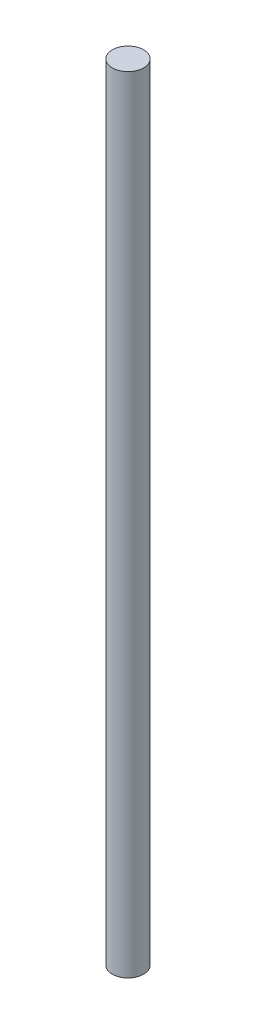
ISO-10303-21;
HEADER;
FILE_DESCRIPTION(('STEP AP214'),'2;1');
FILE_NAME('part.step','',(''),(''),'','','');
FILE_SCHEMA(('AUTOMOTIVE_DESIGN { 1 0 10303 214 1 1 1 1 }'));
ENDSEC;
DATA;
#1=APPLICATION_CONTEXT('core data for automotive mechanical design processes');
#2=APPLICATION_PROTOCOL_DEFINITION('international standard','automotive_design',2000,#1);
#3=PRODUCT_CONTEXT('',#1,'mechanical');
#4=PRODUCT('Part','Part','',(#3));
#5=PRODUCT_RELATED_PRODUCT_CATEGORY('part','',(#4));
#6=PRODUCT_DEFINITION_FORMATION('','',#4);
#7=PRODUCT_DEFINITION_CONTEXT('part definition',#1,'design');
#8=PRODUCT_DEFINITION('design','',#6,#7);
#9=PRODUCT_DEFINITION_SHAPE('','',#8);
#10=(LENGTH_UNIT() NAMED_UNIT(*) SI_UNIT(.MILLI.,.METRE.));
#11=(NAMED_UNIT(*) PLANE_ANGLE_UNIT() SI_UNIT($,.RADIAN.));
#12=(NAMED_UNIT(*) SI_UNIT($,.STERADIAN.) SOLID_ANGLE_UNIT());
#13=UNCERTAINTY_MEASURE_WITH_UNIT(LENGTH_MEASURE(1.E-05),#10,'distance_accuracy_value','');
#14=(GEOMETRIC_REPRESENTATION_CONTEXT(3) GLOBAL_UNCERTAINTY_ASSIGNED_CONTEXT((#13)) GLOBAL_UNIT_ASSIGNED_CONTEXT((#10,
#11,#12)) REPRESENTATION_CONTEXT('',''));
#15=CARTESIAN_POINT('',(0.,0.,0.));
#16=DIRECTION('',(0.,0.,1.));
#17=DIRECTION('',(1.,0.,0.));
#18=AXIS2_PLACEMENT_3D('',#15,#16,#17);
#19=CARTESIAN_POINT('',(0.,150.,0.));
#20=DIRECTION('',(0.,-1.,0.));
#21=DIRECTION('',(0.,0.,-1.));
#22=AXIS2_PLACEMENT_3D('',#19,#20,#21);
#23=CYLINDRICAL_SURFACE('',#22,3.);
#24=CARTESIAN_POINT('',(0.,150.,0.));
#25=DIRECTION('',(0.,1.,0.));
#26=DIRECTION('',(0.,0.,1.));
#27=AXIS2_PLACEMENT_3D('',#24,#25,#26);
#28=CIRCLE('',#27,3.);
#29=CARTESIAN_POINT('',(0.,150.,3.));
#30=VERTEX_POINT('',#29);
#31=EDGE_CURVE('E10',#30,#30,#28,.T.);
#32=ORIENTED_EDGE('',*,*,#31,.F.);
#33=EDGE_LOOP('',(#32));
#34=FACE_BOUND('',#33,.T.);
#35=CARTESIAN_POINT('',(0.,0.,0.));
#36=DIRECTION('',(0.,1.,0.));
#37=DIRECTION('',(0.,0.,1.));
#38=AXIS2_PLACEMENT_3D('',#35,#36,#37);
#39=CIRCLE('',#38,3.);
#40=CARTESIAN_POINT('',(0.,0.,3.));
#41=VERTEX_POINT('',#40);
#42=EDGE_CURVE('E44',#41,#41,#39,.T.);
#43=ORIENTED_EDGE('',*,*,#42,.T.);
#44=EDGE_LOOP('',(#43));
#45=FACE_BOUND('',#44,.T.);
#46=ADVANCED_FACE('F41',(#34,#45),#23,.T.);
#47=CARTESIAN_POINT('',(0.,150.,0.));
#48=DIRECTION('',(0.,1.,0.));
#49=DIRECTION('',(0.,0.,1.));
#50=AXIS2_PLACEMENT_3D('',#47,#48,#49);
#51=PLANE('',#50);
#52=ORIENTED_EDGE('',*,*,#31,.T.);
#53=EDGE_LOOP('',(#52));
#54=FACE_BOUND('',#53,.T.);
#55=ADVANCED_FACE('F58',(#54),#51,.T.);
#56=CARTESIAN_POINT('',(0.,0.,0.));
#57=DIRECTION('',(0.,1.,0.));
#58=DIRECTION('',(0.,0.,1.));
#59=AXIS2_PLACEMENT_3D('',#56,#57,#58);
#60=PLANE('',#59);
#61=ORIENTED_EDGE('',*,*,#42,.F.);
#62=EDGE_LOOP('',(#61));
#63=FACE_BOUND('',#62,.T.);
#64=ADVANCED_FACE('F56',(#63),#60,.F.);
#65=CLOSED_SHELL('',(#46,#55,#64));
#66=MANIFOLD_SOLID_BREP('B2',#65);
#67=ADVANCED_BREP_SHAPE_REPRESENTATION('',(#18,#66),#14);
#68=SHAPE_DEFINITION_REPRESENTATION(#9,#67);
ENDSEC;
END-ISO-10303-21;
